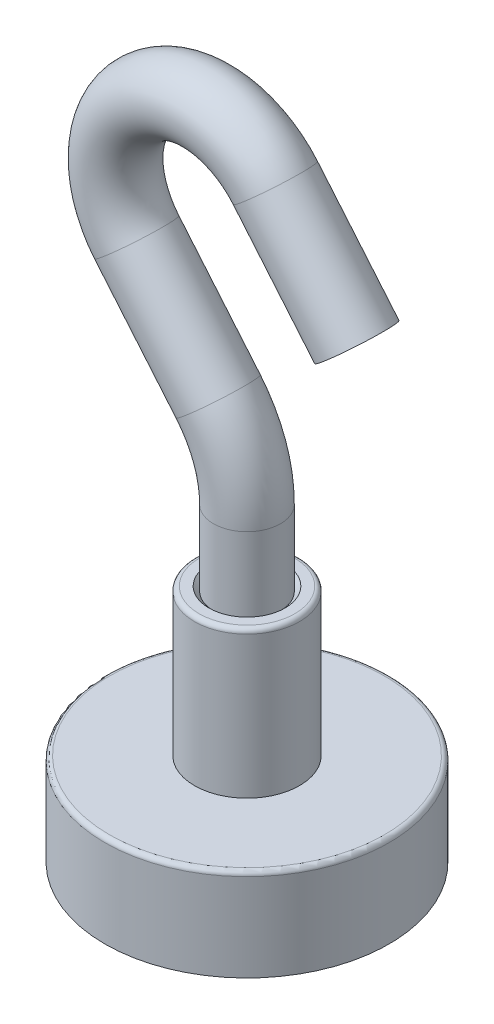
ISO-10303-21;
HEADER;
FILE_DESCRIPTION(('STEP AP214'),'2;1');
FILE_NAME('part.step','',(''),(''),'','','');
FILE_SCHEMA(('AUTOMOTIVE_DESIGN { 1 0 10303 214 1 1 1 1 }'));
ENDSEC;
DATA;
#1=APPLICATION_CONTEXT('core data for automotive mechanical design processes');
#2=APPLICATION_PROTOCOL_DEFINITION('international standard','automotive_design',2000,#1);
#3=PRODUCT_CONTEXT('',#1,'mechanical');
#4=PRODUCT('Part','Part','',(#3));
#5=PRODUCT_RELATED_PRODUCT_CATEGORY('part','',(#4));
#6=PRODUCT_DEFINITION_FORMATION('','',#4);
#7=PRODUCT_DEFINITION_CONTEXT('part definition',#1,'design');
#8=PRODUCT_DEFINITION('design','',#6,#7);
#9=PRODUCT_DEFINITION_SHAPE('','',#8);
#10=(LENGTH_UNIT() NAMED_UNIT(*) SI_UNIT(.MILLI.,.METRE.));
#11=(NAMED_UNIT(*) PLANE_ANGLE_UNIT() SI_UNIT($,.RADIAN.));
#12=(NAMED_UNIT(*) SI_UNIT($,.STERADIAN.) SOLID_ANGLE_UNIT());
#13=UNCERTAINTY_MEASURE_WITH_UNIT(LENGTH_MEASURE(1.E-05),#10,'distance_accuracy_value','');
#14=(GEOMETRIC_REPRESENTATION_CONTEXT(3) GLOBAL_UNCERTAINTY_ASSIGNED_CONTEXT((#13)) GLOBAL_UNIT_ASSIGNED_CONTEXT((#10,
#11,#12)) REPRESENTATION_CONTEXT('',''));
#15=CARTESIAN_POINT('',(0.,0.,0.));
#16=DIRECTION('',(0.,0.,1.));
#17=DIRECTION('',(1.,0.,0.));
#18=AXIS2_PLACEMENT_3D('',#15,#16,#17);
#19=CARTESIAN_POINT('',(0.,-5.1,0.));
#20=DIRECTION('',(0.,1.,0.));
#21=DIRECTION('',(0.,0.,1.));
#22=AXIS2_PLACEMENT_3D('',#19,#20,#21);
#23=CYLINDRICAL_SURFACE('',#22,7.85);
#24=CARTESIAN_POINT('',(0.,-0.254,0.));
#25=DIRECTION('',(0.,1.,0.));
#26=DIRECTION('',(0.,0.,1.));
#27=AXIS2_PLACEMENT_3D('',#24,#25,#26);
#28=CIRCLE('',#27,7.85);
#29=CARTESIAN_POINT('',(0.,-0.254,7.85));
#30=VERTEX_POINT('',#29);
#31=EDGE_CURVE('E66',#30,#30,#28,.F.);
#32=ORIENTED_EDGE('',*,*,#31,.T.);
#33=EDGE_LOOP('',(#32));
#34=FACE_BOUND('',#33,.T.);
#35=CARTESIAN_POINT('',(0.,-5.1,0.));
#36=DIRECTION('',(0.,1.,0.));
#37=DIRECTION('',(0.,0.,1.));
#38=AXIS2_PLACEMENT_3D('',#35,#36,#37);
#39=CIRCLE('',#38,7.85);
#40=CARTESIAN_POINT('',(0.,-5.1,7.85));
#41=VERTEX_POINT('',#40);
#42=EDGE_CURVE('E88',#41,#41,#39,.T.);
#43=ORIENTED_EDGE('',*,*,#42,.T.);
#44=EDGE_LOOP('',(#43));
#45=FACE_BOUND('',#44,.T.);
#46=ADVANCED_FACE('F55',(#34,#45),#23,.T.);
#47=CARTESIAN_POINT('',(0.,-5.1,0.));
#48=DIRECTION('',(0.,1.,0.));
#49=DIRECTION('',(0.,0.,1.));
#50=AXIS2_PLACEMENT_3D('',#47,#48,#49);
#51=PLANE('',#50);
#52=CARTESIAN_POINT('',(0.,-5.1,0.));
#53=DIRECTION('',(0.,-1.,0.));
#54=DIRECTION('',(0.,0.,-1.));
#55=AXIS2_PLACEMENT_3D('',#52,#53,#54);
#56=CIRCLE('',#55,6.25);
#57=CARTESIAN_POINT('',(0.,-5.1,-6.25));
#58=VERTEX_POINT('',#57);
#59=EDGE_CURVE('E94',#58,#58,#56,.T.);
#60=ORIENTED_EDGE('',*,*,#59,.F.);
#61=EDGE_LOOP('',(#60));
#62=FACE_BOUND('',#61,.T.);
#63=ORIENTED_EDGE('',*,*,#42,.F.);
#64=EDGE_LOOP('',(#63));
#65=FACE_BOUND('',#64,.T.);
#66=ADVANCED_FACE('F136',(#62,#65),#51,.F.);
#67=CARTESIAN_POINT('',(0.,0.,0.));
#68=DIRECTION('',(0.,1.,0.));
#69=DIRECTION('',(0.,0.,1.));
#70=AXIS2_PLACEMENT_3D('',#67,#68,#69);
#71=PLANE('',#70);
#72=CARTESIAN_POINT('',(0.,0.,0.));
#73=DIRECTION('',(0.,1.,0.));
#74=DIRECTION('',(0.,0.,1.));
#75=AXIS2_PLACEMENT_3D('',#72,#73,#74);
#76=CIRCLE('',#75,7.596);
#77=CARTESIAN_POINT('',(0.,0.,7.596));
#78=VERTEX_POINT('',#77);
#79=EDGE_CURVE('E70',#78,#78,#76,.T.);
#80=ORIENTED_EDGE('',*,*,#79,.T.);
#81=EDGE_LOOP('',(#80));
#82=FACE_BOUND('',#81,.T.);
#83=CARTESIAN_POINT('',(0.,0.,0.));
#84=DIRECTION('',(0.,1.,0.));
#85=DIRECTION('',(0.,0.,1.));
#86=AXIS2_PLACEMENT_3D('',#83,#84,#85);
#87=CIRCLE('',#86,2.9);
#88=CARTESIAN_POINT('',(0.,0.,2.9));
#89=VERTEX_POINT('',#88);
#90=EDGE_CURVE('E87',#89,#89,#87,.T.);
#91=ORIENTED_EDGE('',*,*,#90,.F.);
#92=EDGE_LOOP('',(#91));
#93=FACE_BOUND('',#92,.T.);
#94=ADVANCED_FACE('F142',(#82,#93),#71,.T.);
#95=CARTESIAN_POINT('',(0.,8.1,0.));
#96=DIRECTION('',(0.,-1.,0.));
#97=DIRECTION('',(0.,0.,-1.));
#98=AXIS2_PLACEMENT_3D('',#95,#96,#97);
#99=CYLINDRICAL_SURFACE('',#98,2.9);
#100=CARTESIAN_POINT('',(0.,7.846,0.));
#101=DIRECTION('',(0.,1.,0.));
#102=DIRECTION('',(0.,0.,1.));
#103=AXIS2_PLACEMENT_3D('',#100,#101,#102);
#104=CIRCLE('',#103,2.9);
#105=CARTESIAN_POINT('',(0.,7.846,2.9));
#106=VERTEX_POINT('',#105);
#107=EDGE_CURVE('E75',#106,#106,#104,.F.);
#108=ORIENTED_EDGE('',*,*,#107,.T.);
#109=EDGE_LOOP('',(#108));
#110=FACE_BOUND('',#109,.T.);
#111=ORIENTED_EDGE('',*,*,#90,.T.);
#112=EDGE_LOOP('',(#111));
#113=FACE_BOUND('',#112,.T.);
#114=ADVANCED_FACE('F175',(#110,#113),#99,.T.);
#115=CARTESIAN_POINT('',(0.,8.1,0.));
#116=DIRECTION('',(0.,1.,0.));
#117=DIRECTION('',(0.,0.,1.));
#118=AXIS2_PLACEMENT_3D('',#115,#116,#117);
#119=PLANE('',#118);
#120=CARTESIAN_POINT('',(0.,8.1,0.));
#121=DIRECTION('',(0.,1.,0.));
#122=DIRECTION('',(0.,0.,1.));
#123=AXIS2_PLACEMENT_3D('',#120,#121,#122);
#124=CIRCLE('',#123,2.646);
#125=CARTESIAN_POINT('',(0.,8.1,2.646));
#126=VERTEX_POINT('',#125);
#127=EDGE_CURVE('E78',#126,#126,#124,.T.);
#128=ORIENTED_EDGE('',*,*,#127,.T.);
#129=EDGE_LOOP('',(#128));
#130=FACE_BOUND('',#129,.T.);
#131=CARTESIAN_POINT('',(0.,8.1,0.));
#132=DIRECTION('',(0.,1.,0.));
#133=DIRECTION('',(0.,0.,1.));
#134=AXIS2_PLACEMENT_3D('',#131,#132,#133);
#135=CIRCLE('',#134,2.104);
#136=CARTESIAN_POINT('',(0.,8.1,2.104));
#137=VERTEX_POINT('',#136);
#138=EDGE_CURVE('E81',#137,#137,#135,.F.);
#139=ORIENTED_EDGE('',*,*,#138,.T.);
#140=EDGE_LOOP('',(#139));
#141=FACE_BOUND('',#140,.T.);
#142=ADVANCED_FACE('F155',(#130,#141),#119,.T.);
#143=CARTESIAN_POINT('',(0.,7.846,0.));
#144=DIRECTION('',(0.,1.,0.));
#145=DIRECTION('',(0.,0.,1.));
#146=AXIS2_PLACEMENT_3D('',#143,#144,#145);
#147=CONICAL_SURFACE('',#146,1.85,0.785398163397453);
#148=ORIENTED_EDGE('',*,*,#138,.F.);
#149=EDGE_LOOP('',(#148));
#150=FACE_BOUND('',#149,.T.);
#151=CARTESIAN_POINT('',(0.,7.846,0.));
#152=DIRECTION('',(0.,1.,0.));
#153=DIRECTION('',(0.,0.,1.));
#154=AXIS2_PLACEMENT_3D('',#151,#152,#153);
#155=CIRCLE('',#154,1.85);
#156=CARTESIAN_POINT('',(0.,7.846,1.85));
#157=VERTEX_POINT('',#156);
#158=EDGE_CURVE('E84',#157,#157,#155,.T.);
#159=ORIENTED_EDGE('',*,*,#158,.F.);
#160=EDGE_LOOP('',(#159));
#161=FACE_BOUND('',#160,.T.);
#162=ADVANCED_FACE('F149',(#150,#161),#147,.F.);
#163=CARTESIAN_POINT('',(0.,7.846,0.));
#164=DIRECTION('',(0.,1.,0.));
#165=DIRECTION('',(0.,0.,1.));
#166=AXIS2_PLACEMENT_3D('',#163,#164,#165);
#167=TOROIDAL_SURFACE('',#166,2.646,0.254);
#168=ORIENTED_EDGE('',*,*,#107,.F.);
#169=EDGE_LOOP('',(#168));
#170=FACE_BOUND('',#169,.T.);
#171=ORIENTED_EDGE('',*,*,#127,.F.);
#172=EDGE_LOOP('',(#171));
#173=FACE_BOUND('',#172,.T.);
#174=ADVANCED_FACE('F154',(#170,#173),#167,.T.);
#175=CARTESIAN_POINT('',(0.,-0.254,0.));
#176=DIRECTION('',(0.,1.,0.));
#177=DIRECTION('',(0.,0.,1.));
#178=AXIS2_PLACEMENT_3D('',#175,#176,#177);
#179=TOROIDAL_SURFACE('',#178,7.596,0.254);
#180=ORIENTED_EDGE('',*,*,#31,.F.);
#181=EDGE_LOOP('',(#180));
#182=FACE_BOUND('',#181,.T.);
#183=ORIENTED_EDGE('',*,*,#79,.F.);
#184=EDGE_LOOP('',(#183));
#185=FACE_BOUND('',#184,.T.);
#186=ADVANCED_FACE('F158',(#182,#185),#179,.T.);
#187=CARTESIAN_POINT('',(0.,-4.846,0.));
#188=DIRECTION('',(0.,-1.,0.));
#189=DIRECTION('',(0.,0.,-1.));
#190=AXIS2_PLACEMENT_3D('',#187,#188,#189);
#191=CYLINDRICAL_SURFACE('',#190,6.25);
#192=CARTESIAN_POINT('',(0.,-4.846,0.));
#193=DIRECTION('',(0.,-1.,0.));
#194=DIRECTION('',(0.,0.,-1.));
#195=AXIS2_PLACEMENT_3D('',#192,#193,#194);
#196=CIRCLE('',#195,6.25);
#197=CARTESIAN_POINT('',(0.,-4.846,-6.25));
#198=VERTEX_POINT('',#197);
#199=EDGE_CURVE('E91',#198,#198,#196,.T.);
#200=ORIENTED_EDGE('',*,*,#199,.F.);
#201=EDGE_LOOP('',(#200));
#202=FACE_BOUND('',#201,.T.);
#203=ORIENTED_EDGE('',*,*,#59,.T.);
#204=EDGE_LOOP('',(#203));
#205=FACE_BOUND('',#204,.T.);
#206=ADVANCED_FACE('F161',(#202,#205),#191,.F.);
#207=CARTESIAN_POINT('',(0.,-4.846,0.));
#208=DIRECTION('',(0.,-1.,0.));
#209=DIRECTION('',(0.,0.,-1.));
#210=AXIS2_PLACEMENT_3D('',#207,#208,#209);
#211=PLANE('',#210);
#212=CARTESIAN_POINT('',(0.,-4.846,0.));
#213=DIRECTION('',(0.,-1.,0.));
#214=DIRECTION('',(0.,0.,-1.));
#215=AXIS2_PLACEMENT_3D('',#212,#213,#214);
#216=CIRCLE('',#215,6.);
#217=CARTESIAN_POINT('',(0.,-4.846,-6.));
#218=VERTEX_POINT('',#217);
#219=EDGE_CURVE('E97',#218,#218,#216,.T.);
#220=ORIENTED_EDGE('',*,*,#219,.F.);
#221=EDGE_LOOP('',(#220));
#222=FACE_BOUND('',#221,.T.);
#223=ORIENTED_EDGE('',*,*,#199,.T.);
#224=EDGE_LOOP('',(#223));
#225=FACE_BOUND('',#224,.T.);
#226=ADVANCED_FACE('F166',(#222,#225),#211,.T.);
#227=CARTESIAN_POINT('',(0.,-4.846,0.));
#228=DIRECTION('',(0.,-1.,0.));
#229=DIRECTION('',(0.,0.,-1.));
#230=AXIS2_PLACEMENT_3D('',#227,#228,#229);
#231=CYLINDRICAL_SURFACE('',#230,6.);
#232=CARTESIAN_POINT('',(0.,-5.,0.));
#233=DIRECTION('',(0.,1.,0.));
#234=DIRECTION('',(0.,0.,1.));
#235=AXIS2_PLACEMENT_3D('',#232,#233,#234);
#236=CIRCLE('',#235,6.);
#237=CARTESIAN_POINT('',(0.,-5.,6.));
#238=VERTEX_POINT('',#237);
#239=EDGE_CURVE('E13',#238,#238,#236,.T.);
#240=ORIENTED_EDGE('',*,*,#239,.T.);
#241=EDGE_LOOP('',(#240));
#242=FACE_BOUND('',#241,.T.);
#243=ORIENTED_EDGE('',*,*,#219,.T.);
#244=EDGE_LOOP('',(#243));
#245=FACE_BOUND('',#244,.T.);
#246=ADVANCED_FACE('F189',(#242,#245),#231,.T.);
#247=CARTESIAN_POINT('',(0.,-5.1,0.));
#248=DIRECTION('',(0.,1.,0.));
#249=DIRECTION('',(0.,0.,1.));
#250=AXIS2_PLACEMENT_3D('',#247,#248,#249);
#251=CIRCLE('',#250,5.9);
#252=CARTESIAN_POINT('',(0.,-5.1,5.9));
#253=VERTEX_POINT('',#252);
#254=EDGE_CURVE('E62',#253,#253,#251,.F.);
#255=ORIENTED_EDGE('',*,*,#254,.T.);
#256=EDGE_LOOP('',(#255));
#257=FACE_BOUND('',#256,.T.);
#258=ADVANCED_FACE('F132',(#257),#51,.F.);
#259=CARTESIAN_POINT('',(6.06954664439886,22.8036269465998,0.));
#260=DIRECTION('',(0.642787609686537,-0.76604444311898,0.));
#261=DIRECTION('',(0.,0.,1.));
#262=AXIS2_PLACEMENT_3D('',#259,#260,#261);
#263=PLANE('',#262);
#264=CARTESIAN_POINT('',(6.06954664439886,22.8036269465998,0.));
#265=DIRECTION('',(0.642787609686537,-0.76604444311898,0.));
#266=DIRECTION('',(0.,0.,1.));
#267=AXIS2_PLACEMENT_3D('',#264,#265,#266);
#268=CIRCLE('',#267,1.85);
#269=CARTESIAN_POINT('',(6.06954664439886,22.8036269465998,1.85));
#270=VERTEX_POINT('',#269);
#271=EDGE_CURVE('E102',#270,#270,#268,.T.);
#272=ORIENTED_EDGE('',*,*,#271,.T.);
#273=EDGE_LOOP('',(#272));
#274=FACE_BOUND('',#273,.T.);
#275=ADVANCED_FACE('F122',(#274),#263,.T.);
#276=CARTESIAN_POINT('',(0.,3.782,0.));
#277=DIRECTION('',(0.,1.,0.));
#278=DIRECTION('',(0.,0.,1.));
#279=AXIS2_PLACEMENT_3D('',#276,#277,#278);
#280=CYLINDRICAL_SURFACE('',#279,1.85);
#281=ORIENTED_EDGE('',*,*,#158,.T.);
#282=EDGE_LOOP('',(#281));
#283=FACE_BOUND('',#282,.T.);
#284=CARTESIAN_POINT('',(0.,12.004795103866,0.));
#285=DIRECTION('',(0.,1.,0.));
#286=DIRECTION('',(0.,0.,1.));
#287=AXIS2_PLACEMENT_3D('',#284,#285,#286);
#288=CIRCLE('',#287,1.85);
#289=CARTESIAN_POINT('',(1.85,12.004795103866,0.));
#290=VERTEX_POINT('',#289);
#291=EDGE_CURVE('E114',#290,#290,#288,.T.);
#292=ORIENTED_EDGE('',*,*,#291,.F.);
#293=EDGE_LOOP('',(#292));
#294=FACE_BOUND('',#293,.T.);
#295=ADVANCED_FACE('F120',(#283,#294),#280,.T.);
#296=CARTESIAN_POINT('',(-6.8,12.004795103866,0.));
#297=DIRECTION('',(0.,0.,1.));
#298=DIRECTION('',(1.,0.,0.));
#299=AXIS2_PLACEMENT_3D('',#296,#297,#298);
#300=TOROIDAL_SURFACE('',#299,6.8,1.85);
#301=CARTESIAN_POINT('',(-1.59089778679094,16.3757508497344,0.));
#302=DIRECTION('',(-0.642787609686537,0.76604444311898,0.));
#303=DIRECTION('',(0.,0.,1.));
#304=AXIS2_PLACEMENT_3D('',#301,#302,#303);
#305=CIRCLE('',#304,1.85);
#306=CARTESIAN_POINT('',(-0.173715567020827,17.5649079276545,0.));
#307=VERTEX_POINT('',#306);
#308=EDGE_CURVE('E111',#307,#307,#305,.T.);
#309=CARTESIAN_POINT('',(-6.8,12.004795103866,0.));
#310=DIRECTION('',(0.,0.,1.));
#311=DIRECTION('',(1.,0.,0.));
#312=AXIS2_PLACEMENT_3D('',#309,#310,#311);
#313=CIRCLE('',#312,8.65);
#314=EDGE_CURVE('',#290,#307,#313,.T.);
#315=ORIENTED_EDGE('',*,*,#291,.T.);
#316=ORIENTED_EDGE('',*,*,#308,.F.);
#317=ORIENTED_EDGE('',*,*,#314,.T.);
#318=ORIENTED_EDGE('',*,*,#314,.F.);
#319=EDGE_LOOP('',(#315,#317,#316,#318));
#320=FACE_BOUND('',#319,.T.);
#321=ADVANCED_FACE('F118',(#320),#300,.T.);
#322=CARTESIAN_POINT('',(-1.59089778679094,16.3757508497344,0.));
#323=DIRECTION('',(-0.642787609686538,0.76604444311898,0.));
#324=DIRECTION('',(-0.76604444311898,-0.642787609686538,0.));
#325=AXIS2_PLACEMENT_3D('',#322,#323,#324);
#326=CYLINDRICAL_SURFACE('',#325,1.85);
#327=CARTESIAN_POINT('',(-6.0904110545967,21.7380619515673,0.));
#328=DIRECTION('',(-0.642787609686537,0.76604444311898,0.));
#329=DIRECTION('',(0.,0.,1.));
#330=AXIS2_PLACEMENT_3D('',#327,#328,#329);
#331=CIRCLE('',#330,1.85);
#332=CARTESIAN_POINT('',(-7.50759327436681,20.5489048736472,0.));
#333=VERTEX_POINT('',#332);
#334=EDGE_CURVE('E108',#333,#333,#331,.T.);
#335=ORIENTED_EDGE('',*,*,#334,.F.);
#336=EDGE_LOOP('',(#335));
#337=FACE_BOUND('',#336,.T.);
#338=ORIENTED_EDGE('',*,*,#308,.T.);
#339=EDGE_LOOP('',(#338));
#340=FACE_BOUND('',#339,.T.);
#341=ADVANCED_FACE('F129',(#337,#340),#326,.T.);
#342=CARTESIAN_POINT('',(-2.2601888390018,24.952,0.));
#343=DIRECTION('',(0.,0.,-1.));
#344=DIRECTION('',(-1.,0.,0.));
#345=AXIS2_PLACEMENT_3D('',#342,#343,#344);
#346=TOROIDAL_SURFACE('',#345,5.,1.85);
#347=CARTESIAN_POINT('',(1.5700333765931,28.1659380484327,0.));
#348=DIRECTION('',(0.642787609686537,-0.76604444311898,0.));
#349=DIRECTION('',(0.,0.,1.));
#350=AXIS2_PLACEMENT_3D('',#347,#348,#349);
#351=CIRCLE('',#350,1.85);
#352=CARTESIAN_POINT('',(2.98721559636321,29.3550951263528,0.));
#353=VERTEX_POINT('',#352);
#354=EDGE_CURVE('E105',#353,#353,#351,.T.);
#355=CARTESIAN_POINT('',(-2.2601888390018,24.952,0.));
#356=DIRECTION('',(0.,0.,-1.));
#357=DIRECTION('',(-1.,0.,0.));
#358=AXIS2_PLACEMENT_3D('',#355,#356,#357);
#359=CIRCLE('',#358,6.85);
#360=EDGE_CURVE('',#333,#353,#359,.T.);
#361=ORIENTED_EDGE('',*,*,#334,.T.);
#362=ORIENTED_EDGE('',*,*,#354,.F.);
#363=ORIENTED_EDGE('',*,*,#360,.T.);
#364=ORIENTED_EDGE('',*,*,#360,.F.);
#365=EDGE_LOOP('',(#361,#363,#362,#364));
#366=FACE_BOUND('',#365,.T.);
#367=ADVANCED_FACE('F196',(#366),#346,.T.);
#368=CARTESIAN_POINT('',(1.5700333765931,28.1659380484327,0.));
#369=DIRECTION('',(0.642787609686537,-0.76604444311898,0.));
#370=DIRECTION('',(0.76604444311898,0.642787609686537,0.));
#371=AXIS2_PLACEMENT_3D('',#368,#369,#370);
#372=CYLINDRICAL_SURFACE('',#371,1.85);
#373=ORIENTED_EDGE('',*,*,#271,.F.);
#374=EDGE_LOOP('',(#373));
#375=FACE_BOUND('',#374,.T.);
#376=ORIENTED_EDGE('',*,*,#354,.T.);
#377=EDGE_LOOP('',(#376));
#378=FACE_BOUND('',#377,.T.);
#379=ADVANCED_FACE('F193',(#375,#378),#372,.T.);
#380=CARTESIAN_POINT('',(0.,-5.,0.));
#381=DIRECTION('',(0.,1.,0.));
#382=DIRECTION('',(0.,0.,1.));
#383=AXIS2_PLACEMENT_3D('',#380,#381,#382);
#384=TOROIDAL_SURFACE('',#383,5.9,0.1);
#385=ORIENTED_EDGE('',*,*,#239,.F.);
#386=EDGE_LOOP('',(#385));
#387=FACE_BOUND('',#386,.T.);
#388=ORIENTED_EDGE('',*,*,#254,.F.);
#389=EDGE_LOOP('',(#388));
#390=FACE_BOUND('',#389,.T.);
#391=ADVANCED_FACE('F57',(#387,#390),#384,.T.);
#392=CLOSED_SHELL('',(#46,#66,#94,#114,#142,#162,#174,#186,#206,#226,#246,#258,#275,#295,#321,
#341,#367,#379,#391));
#393=MANIFOLD_SOLID_BREP('B2',#392);
#394=ADVANCED_BREP_SHAPE_REPRESENTATION('',(#18,#393),#14);
#395=SHAPE_DEFINITION_REPRESENTATION(#9,#394);
ENDSEC;
END-ISO-10303-21;
